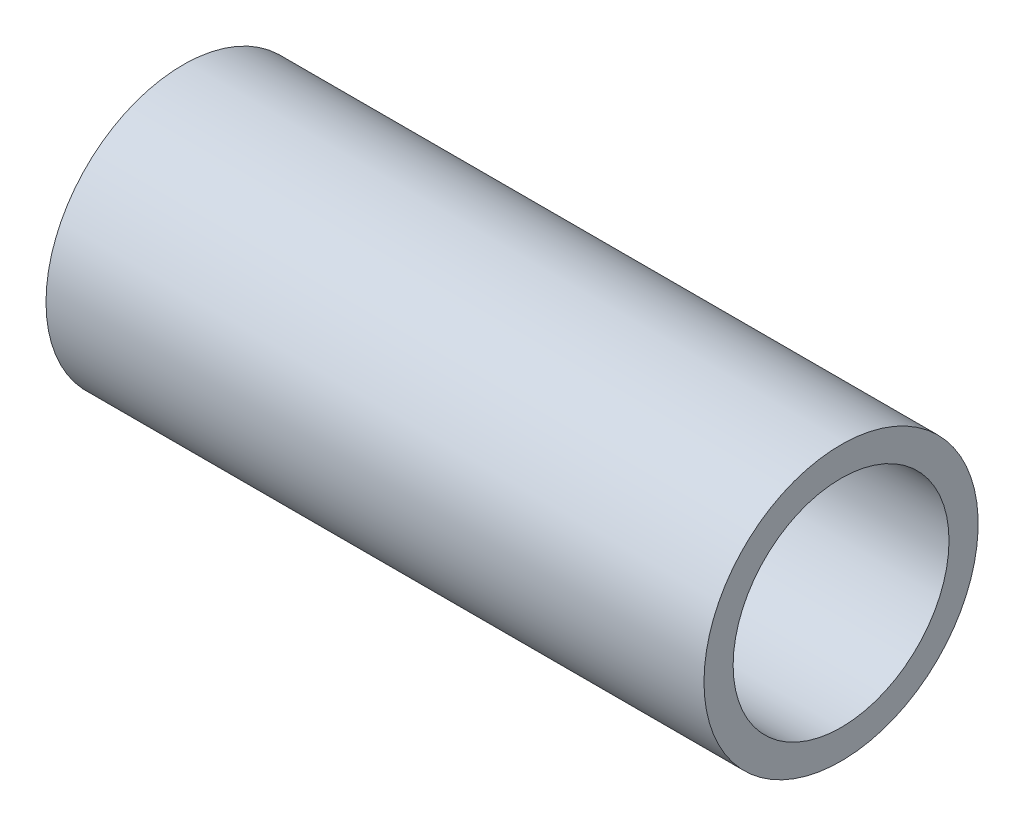
ISO-10303-21;
HEADER;
FILE_DESCRIPTION(('STEP AP214'),'2;1');
FILE_NAME('part.step','',(''),(''),'','','');
FILE_SCHEMA(('AUTOMOTIVE_DESIGN { 1 0 10303 214 1 1 1 1 }'));
ENDSEC;
DATA;
#1=APPLICATION_CONTEXT('core data for automotive mechanical design processes');
#2=APPLICATION_PROTOCOL_DEFINITION('international standard','automotive_design',2000,#1);
#3=PRODUCT_CONTEXT('',#1,'mechanical');
#4=PRODUCT('Part','Part','',(#3));
#5=PRODUCT_RELATED_PRODUCT_CATEGORY('part','',(#4));
#6=PRODUCT_DEFINITION_FORMATION('','',#4);
#7=PRODUCT_DEFINITION_CONTEXT('part definition',#1,'design');
#8=PRODUCT_DEFINITION('design','',#6,#7);
#9=PRODUCT_DEFINITION_SHAPE('','',#8);
#10=(LENGTH_UNIT() NAMED_UNIT(*) SI_UNIT(.MILLI.,.METRE.));
#11=(NAMED_UNIT(*) PLANE_ANGLE_UNIT() SI_UNIT($,.RADIAN.));
#12=(NAMED_UNIT(*) SI_UNIT($,.STERADIAN.) SOLID_ANGLE_UNIT());
#13=UNCERTAINTY_MEASURE_WITH_UNIT(LENGTH_MEASURE(1.E-05),#10,'distance_accuracy_value','');
#14=(GEOMETRIC_REPRESENTATION_CONTEXT(3) GLOBAL_UNCERTAINTY_ASSIGNED_CONTEXT((#13)) GLOBAL_UNIT_ASSIGNED_CONTEXT((#10,
#11,#12)) REPRESENTATION_CONTEXT('',''));
#15=CARTESIAN_POINT('',(0.,0.,0.));
#16=DIRECTION('',(0.,0.,1.));
#17=DIRECTION('',(1.,0.,0.));
#18=AXIS2_PLACEMENT_3D('',#15,#16,#17);
#19=CARTESIAN_POINT('',(76.2,0.,0.));
#20=DIRECTION('',(1.,0.,0.));
#21=DIRECTION('',(0.,0.,-1.));
#22=AXIS2_PLACEMENT_3D('',#19,#20,#21);
#23=PLANE('',#22);
#24=CARTESIAN_POINT('',(76.2,0.,0.));
#25=DIRECTION('',(1.,0.,0.));
#26=DIRECTION('',(0.,0.,-1.));
#27=AXIS2_PLACEMENT_3D('',#24,#25,#26);
#28=CIRCLE('',#27,15.875);
#29=CARTESIAN_POINT('',(76.2,0.,15.875));
#30=VERTEX_POINT('',#29);
#31=EDGE_CURVE('E10',#30,#30,#28,.T.);
#32=ORIENTED_EDGE('',*,*,#31,.T.);
#33=EDGE_LOOP('',(#32));
#34=FACE_BOUND('',#33,.T.);
#35=CARTESIAN_POINT('',(76.2,0.,0.));
#36=DIRECTION('',(1.,0.,0.));
#37=DIRECTION('',(0.,0.,-1.));
#38=AXIS2_PLACEMENT_3D('',#35,#36,#37);
#39=CIRCLE('',#38,12.5);
#40=CARTESIAN_POINT('',(76.2,0.,12.5));
#41=VERTEX_POINT('',#40);
#42=EDGE_CURVE('E44',#41,#41,#39,.T.);
#43=ORIENTED_EDGE('',*,*,#42,.F.);
#44=EDGE_LOOP('',(#43));
#45=FACE_BOUND('',#44,.T.);
#46=ADVANCED_FACE('F32',(#34,#45),#23,.T.);
#47=CARTESIAN_POINT('',(0.,0.,0.));
#48=DIRECTION('',(1.,0.,0.));
#49=DIRECTION('',(0.,0.,-1.));
#50=AXIS2_PLACEMENT_3D('',#47,#48,#49);
#51=PLANE('',#50);
#52=CARTESIAN_POINT('',(0.,0.,0.));
#53=DIRECTION('',(1.,0.,0.));
#54=DIRECTION('',(0.,0.,-1.));
#55=AXIS2_PLACEMENT_3D('',#52,#53,#54);
#56=CIRCLE('',#55,15.875);
#57=CARTESIAN_POINT('',(0.,0.,15.875));
#58=VERTEX_POINT('',#57);
#59=EDGE_CURVE('E36',#58,#58,#56,.T.);
#60=ORIENTED_EDGE('',*,*,#59,.F.);
#61=EDGE_LOOP('',(#60));
#62=FACE_BOUND('',#61,.T.);
#63=CARTESIAN_POINT('',(0.,0.,0.));
#64=DIRECTION('',(1.,0.,0.));
#65=DIRECTION('',(0.,0.,-1.));
#66=AXIS2_PLACEMENT_3D('',#63,#64,#65);
#67=CIRCLE('',#66,12.5);
#68=CARTESIAN_POINT('',(0.,0.,12.5));
#69=VERTEX_POINT('',#68);
#70=EDGE_CURVE('E46',#69,#69,#67,.T.);
#71=ORIENTED_EDGE('',*,*,#70,.T.);
#72=EDGE_LOOP('',(#71));
#73=FACE_BOUND('',#72,.T.);
#74=ADVANCED_FACE('F60',(#62,#73),#51,.F.);
#75=CARTESIAN_POINT('',(76.2,0.,0.));
#76=DIRECTION('',(-1.,0.,0.));
#77=DIRECTION('',(0.,0.,1.));
#78=AXIS2_PLACEMENT_3D('',#75,#76,#77);
#79=CYLINDRICAL_SURFACE('',#78,15.875);
#80=CARTESIAN_POINT('',(76.2,0.,15.875));
#81=CARTESIAN_POINT('',(75.40625,0.,15.875));
#82=CARTESIAN_POINT('',(74.6125,0.,15.875));
#83=CARTESIAN_POINT('',(73.025,0.,15.875));
#84=CARTESIAN_POINT('',(72.23125,0.,15.875));
#85=CARTESIAN_POINT('',(70.64375,0.,15.875));
#86=CARTESIAN_POINT('',(69.85,0.,15.875));
#87=CARTESIAN_POINT('',(68.2625,0.,15.875));
#88=CARTESIAN_POINT('',(67.46875,0.,15.875));
#89=CARTESIAN_POINT('',(65.88125,0.,15.875));
#90=CARTESIAN_POINT('',(65.0875,0.,15.875));
#91=CARTESIAN_POINT('',(63.5,0.,15.875));
#92=CARTESIAN_POINT('',(62.70625,0.,15.875));
#93=CARTESIAN_POINT('',(61.11875,0.,15.875));
#94=CARTESIAN_POINT('',(60.325,0.,15.875));
#95=CARTESIAN_POINT('',(58.7375,0.,15.875));
#96=CARTESIAN_POINT('',(57.94375,0.,15.875));
#97=CARTESIAN_POINT('',(56.35625,0.,15.875));
#98=CARTESIAN_POINT('',(55.5625,0.,15.875));
#99=CARTESIAN_POINT('',(53.975,0.,15.875));
#100=CARTESIAN_POINT('',(53.18125,0.,15.875));
#101=CARTESIAN_POINT('',(51.59375,0.,15.875));
#102=CARTESIAN_POINT('',(50.8,0.,15.875));
#103=CARTESIAN_POINT('',(49.2125,0.,15.875));
#104=CARTESIAN_POINT('',(48.41875,0.,15.875));
#105=CARTESIAN_POINT('',(46.83125,0.,15.875));
#106=CARTESIAN_POINT('',(46.0375,0.,15.875));
#107=CARTESIAN_POINT('',(44.45,0.,15.875));
#108=CARTESIAN_POINT('',(43.65625,0.,15.875));
#109=CARTESIAN_POINT('',(42.06875,0.,15.875));
#110=CARTESIAN_POINT('',(41.275,0.,15.875));
#111=CARTESIAN_POINT('',(39.6875,0.,15.875));
#112=CARTESIAN_POINT('',(38.89375,0.,15.875));
#113=CARTESIAN_POINT('',(37.30625,0.,15.875));
#114=CARTESIAN_POINT('',(36.5125,0.,15.875));
#115=CARTESIAN_POINT('',(34.925,0.,15.875));
#116=CARTESIAN_POINT('',(34.13125,0.,15.875));
#117=CARTESIAN_POINT('',(32.54375,0.,15.875));
#118=CARTESIAN_POINT('',(31.75,0.,15.875));
#119=CARTESIAN_POINT('',(30.1625,0.,15.875));
#120=CARTESIAN_POINT('',(29.36875,0.,15.875));
#121=CARTESIAN_POINT('',(27.78125,0.,15.875));
#122=CARTESIAN_POINT('',(26.9875,0.,15.875));
#123=CARTESIAN_POINT('',(25.4,0.,15.875));
#124=CARTESIAN_POINT('',(24.60625,0.,15.875));
#125=CARTESIAN_POINT('',(23.01875,0.,15.875));
#126=CARTESIAN_POINT('',(22.225,0.,15.875));
#127=CARTESIAN_POINT('',(20.6375,0.,15.875));
#128=CARTESIAN_POINT('',(19.84375,0.,15.875));
#129=CARTESIAN_POINT('',(18.25625,0.,15.875));
#130=CARTESIAN_POINT('',(17.4625,0.,15.875));
#131=CARTESIAN_POINT('',(15.875,0.,15.875));
#132=CARTESIAN_POINT('',(15.08125,0.,15.875));
#133=CARTESIAN_POINT('',(13.49375,0.,15.875));
#134=CARTESIAN_POINT('',(12.7,0.,15.875));
#135=CARTESIAN_POINT('',(11.1125,0.,15.875));
#136=CARTESIAN_POINT('',(10.31875,0.,15.875));
#137=CARTESIAN_POINT('',(8.73125,0.,15.875));
#138=CARTESIAN_POINT('',(7.93750000000001,0.,15.875));
#139=CARTESIAN_POINT('',(6.35,0.,15.875));
#140=CARTESIAN_POINT('',(5.55625,0.,15.875));
#141=CARTESIAN_POINT('',(3.96875,0.,15.875));
#142=CARTESIAN_POINT('',(3.175,0.,15.875));
#143=CARTESIAN_POINT('',(1.5875,0.,15.875));
#144=CARTESIAN_POINT('',(0.793750000000001,0.,15.875));
#145=CARTESIAN_POINT('',(0.,0.,15.875));
#146=B_SPLINE_CURVE_WITH_KNOTS('',3,(#80,#81,#82,#83,#84,#85,#86,#87,#88,#89,#90,#91,#92,#93,
#94,#95,#96,#97,#98,#99,#100,#101,#102,#103,#104,#105,#106,#107,#108,#109,#110,#111,#112,#113,
#114,#115,#116,#117,#118,#119,#120,#121,#122,#123,#124,#125,#126,#127,#128,#129,#130,#131,#132,
#133,#134,#135,#136,#137,#138,#139,#140,#141,#142,#143,#144,#145),.UNSPECIFIED.,.F.,.F.,(4,2,2,
2,2,2,2,2,2,2,2,2,2,2,2,2,2,2,2,2,2,2,2,2,2,2,2,2,2,2,2,2,4),(0.,2.38125,4.7625,7.14375,
9.52500000000001,11.90625,14.2875,16.66875,19.05,21.43125,23.8125,26.19375,28.575,30.95625,
33.3375,35.71875,38.1,40.48125,42.8625,45.24375,47.625,50.00625,52.3875,54.76875,57.15,59.53125,
61.9125,64.29375,66.675,69.05625,71.4375,73.81875,76.2),.UNSPECIFIED.);
#147=EDGE_CURVE('BSEAM34',#30,#58,#146,.T.);
#148=ORIENTED_EDGE('',*,*,#31,.F.);
#149=ORIENTED_EDGE('',*,*,#59,.T.);
#150=ORIENTED_EDGE('',*,*,#147,.T.);
#151=ORIENTED_EDGE('',*,*,#147,.F.);
#152=EDGE_LOOP('',(#148,#150,#149,#151));
#153=FACE_BOUND('',#152,.T.);
#154=ADVANCED_FACE('F34',(#153),#79,.T.);
#155=CARTESIAN_POINT('',(76.2,0.,0.));
#156=DIRECTION('',(-1.,0.,0.));
#157=DIRECTION('',(0.,0.,1.));
#158=AXIS2_PLACEMENT_3D('',#155,#156,#157);
#159=CYLINDRICAL_SURFACE('',#158,12.5);
#160=CARTESIAN_POINT('',(76.2,0.,12.5));
#161=CARTESIAN_POINT('',(75.40625,0.,12.5));
#162=CARTESIAN_POINT('',(74.6125,0.,12.5));
#163=CARTESIAN_POINT('',(73.025,0.,12.5));
#164=CARTESIAN_POINT('',(72.23125,0.,12.5));
#165=CARTESIAN_POINT('',(70.64375,0.,12.5));
#166=CARTESIAN_POINT('',(69.85,0.,12.5));
#167=CARTESIAN_POINT('',(68.2625,0.,12.5));
#168=CARTESIAN_POINT('',(67.46875,0.,12.5));
#169=CARTESIAN_POINT('',(65.88125,0.,12.5));
#170=CARTESIAN_POINT('',(65.0875,0.,12.5));
#171=CARTESIAN_POINT('',(63.5,0.,12.5));
#172=CARTESIAN_POINT('',(62.70625,0.,12.5));
#173=CARTESIAN_POINT('',(61.11875,0.,12.5));
#174=CARTESIAN_POINT('',(60.325,0.,12.5));
#175=CARTESIAN_POINT('',(58.7375,0.,12.5));
#176=CARTESIAN_POINT('',(57.94375,0.,12.5));
#177=CARTESIAN_POINT('',(56.35625,0.,12.5));
#178=CARTESIAN_POINT('',(55.5625,0.,12.5));
#179=CARTESIAN_POINT('',(53.975,0.,12.5));
#180=CARTESIAN_POINT('',(53.18125,0.,12.5));
#181=CARTESIAN_POINT('',(51.59375,0.,12.5));
#182=CARTESIAN_POINT('',(50.8,0.,12.5));
#183=CARTESIAN_POINT('',(49.2125,0.,12.5));
#184=CARTESIAN_POINT('',(48.41875,0.,12.5));
#185=CARTESIAN_POINT('',(46.83125,0.,12.5));
#186=CARTESIAN_POINT('',(46.0375,0.,12.5));
#187=CARTESIAN_POINT('',(44.45,0.,12.5));
#188=CARTESIAN_POINT('',(43.65625,0.,12.5));
#189=CARTESIAN_POINT('',(42.06875,0.,12.5));
#190=CARTESIAN_POINT('',(41.275,0.,12.5));
#191=CARTESIAN_POINT('',(39.6875,0.,12.5));
#192=CARTESIAN_POINT('',(38.89375,0.,12.5));
#193=CARTESIAN_POINT('',(37.30625,0.,12.5));
#194=CARTESIAN_POINT('',(36.5125,0.,12.5));
#195=CARTESIAN_POINT('',(34.925,0.,12.5));
#196=CARTESIAN_POINT('',(34.13125,0.,12.5));
#197=CARTESIAN_POINT('',(32.54375,0.,12.5));
#198=CARTESIAN_POINT('',(31.75,0.,12.5));
#199=CARTESIAN_POINT('',(30.1625,0.,12.5));
#200=CARTESIAN_POINT('',(29.36875,0.,12.5));
#201=CARTESIAN_POINT('',(27.78125,0.,12.5));
#202=CARTESIAN_POINT('',(26.9875,0.,12.5));
#203=CARTESIAN_POINT('',(25.4,0.,12.5));
#204=CARTESIAN_POINT('',(24.60625,0.,12.5));
#205=CARTESIAN_POINT('',(23.01875,0.,12.5));
#206=CARTESIAN_POINT('',(22.225,0.,12.5));
#207=CARTESIAN_POINT('',(20.6375,0.,12.5));
#208=CARTESIAN_POINT('',(19.84375,0.,12.5));
#209=CARTESIAN_POINT('',(18.25625,0.,12.5));
#210=CARTESIAN_POINT('',(17.4625,0.,12.5));
#211=CARTESIAN_POINT('',(15.875,0.,12.5));
#212=CARTESIAN_POINT('',(15.08125,0.,12.5));
#213=CARTESIAN_POINT('',(13.49375,0.,12.5));
#214=CARTESIAN_POINT('',(12.7,0.,12.5));
#215=CARTESIAN_POINT('',(11.1125,0.,12.5));
#216=CARTESIAN_POINT('',(10.31875,0.,12.5));
#217=CARTESIAN_POINT('',(8.73125,0.,12.5));
#218=CARTESIAN_POINT('',(7.93750000000001,0.,12.5));
#219=CARTESIAN_POINT('',(6.35,0.,12.5));
#220=CARTESIAN_POINT('',(5.55625,0.,12.5));
#221=CARTESIAN_POINT('',(3.96875,0.,12.5));
#222=CARTESIAN_POINT('',(3.175,0.,12.5));
#223=CARTESIAN_POINT('',(1.5875,0.,12.5));
#224=CARTESIAN_POINT('',(0.793750000000001,0.,12.5));
#225=CARTESIAN_POINT('',(0.,0.,12.5));
#226=B_SPLINE_CURVE_WITH_KNOTS('',3,(#160,#161,#162,#163,#164,#165,#166,#167,#168,#169,#170,
#171,#172,#173,#174,#175,#176,#177,#178,#179,#180,#181,#182,#183,#184,#185,#186,#187,#188,#189,
#190,#191,#192,#193,#194,#195,#196,#197,#198,#199,#200,#201,#202,#203,#204,#205,#206,#207,#208,
#209,#210,#211,#212,#213,#214,#215,#216,#217,#218,#219,#220,#221,#222,#223,#224,#225),
.UNSPECIFIED.,.F.,.F.,(4,2,2,2,2,2,2,2,2,2,2,2,2,2,2,2,2,2,2,2,2,2,2,2,2,2,2,2,2,2,2,2,4),(0.,
2.38125,4.7625,7.14375,9.52500000000001,11.90625,14.2875,16.66875,19.05,21.43125,23.8125,
26.19375,28.575,30.95625,33.3375,35.71875,38.1,40.48125,42.8625,45.24375,47.625,50.00625,
52.3875,54.76875,57.15,59.53125,61.9125,64.29375,66.675,69.05625,71.4375,73.81875,76.2),.UNSPECIFIED.);
#227=EDGE_CURVE('BSEAM56',#41,#69,#226,.T.);
#228=ORIENTED_EDGE('',*,*,#42,.T.);
#229=ORIENTED_EDGE('',*,*,#70,.F.);
#230=ORIENTED_EDGE('',*,*,#227,.T.);
#231=ORIENTED_EDGE('',*,*,#227,.F.);
#232=EDGE_LOOP('',(#228,#230,#229,#231));
#233=FACE_BOUND('',#232,.T.);
#234=ADVANCED_FACE('F56',(#233),#159,.F.);
#235=CLOSED_SHELL('',(#46,#74,#154,#234));
#236=MANIFOLD_SOLID_BREP('B2',#235);
#237=ADVANCED_BREP_SHAPE_REPRESENTATION('',(#18,#236),#14);
#238=SHAPE_DEFINITION_REPRESENTATION(#9,#237);
ENDSEC;
END-ISO-10303-21;
